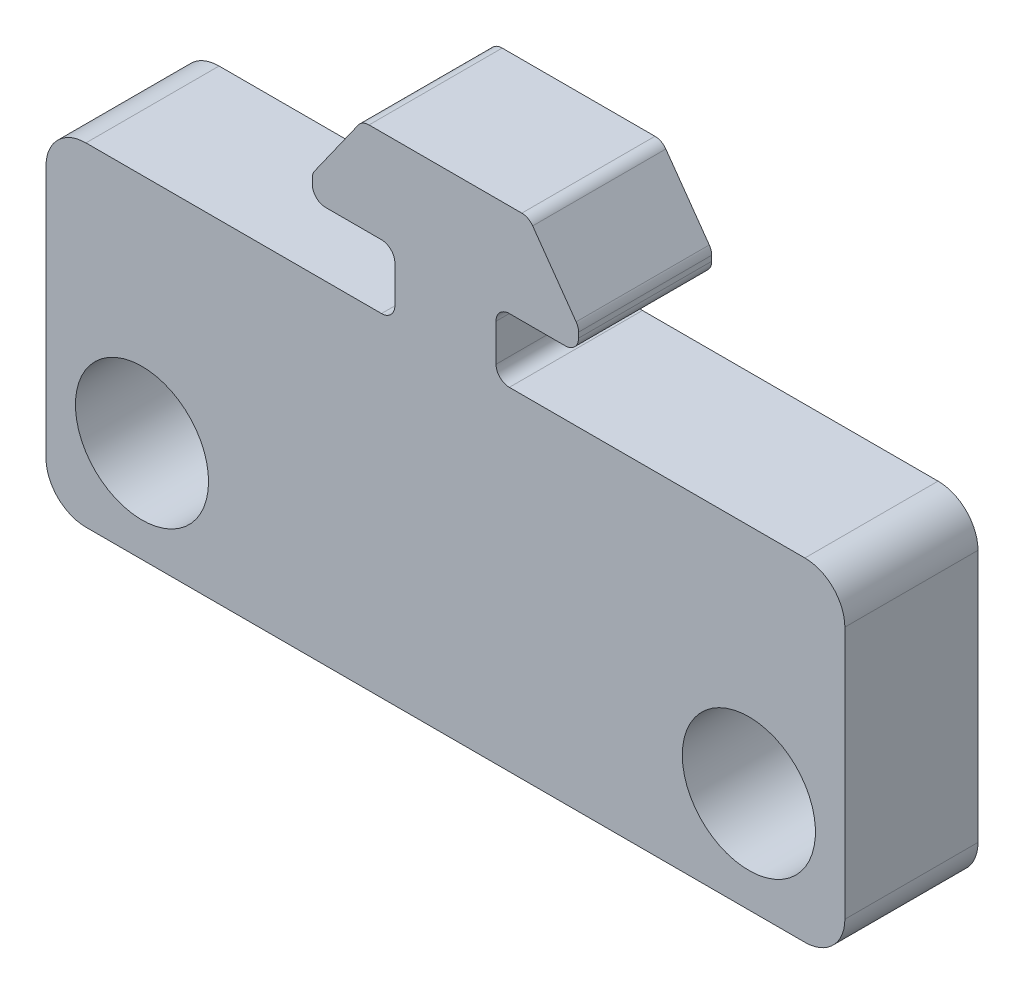
ISO-10303-21;
HEADER;
FILE_DESCRIPTION(('STEP AP214'),'2;1');
FILE_NAME('part.step','',(''),(''),'','','');
FILE_SCHEMA(('AUTOMOTIVE_DESIGN { 1 0 10303 214 1 1 1 1 }'));
ENDSEC;
DATA;
#1=APPLICATION_CONTEXT('core data for automotive mechanical design processes');
#2=APPLICATION_PROTOCOL_DEFINITION('international standard','automotive_design',2000,#1);
#3=PRODUCT_CONTEXT('',#1,'mechanical');
#4=PRODUCT('Part','Part','',(#3));
#5=PRODUCT_RELATED_PRODUCT_CATEGORY('part','',(#4));
#6=PRODUCT_DEFINITION_FORMATION('','',#4);
#7=PRODUCT_DEFINITION_CONTEXT('part definition',#1,'design');
#8=PRODUCT_DEFINITION('design','',#6,#7);
#9=PRODUCT_DEFINITION_SHAPE('','',#8);
#10=(LENGTH_UNIT() NAMED_UNIT(*) SI_UNIT(.MILLI.,.METRE.));
#11=(NAMED_UNIT(*) PLANE_ANGLE_UNIT() SI_UNIT($,.RADIAN.));
#12=(NAMED_UNIT(*) SI_UNIT($,.STERADIAN.) SOLID_ANGLE_UNIT());
#13=UNCERTAINTY_MEASURE_WITH_UNIT(LENGTH_MEASURE(1.E-05),#10,'distance_accuracy_value','');
#14=(GEOMETRIC_REPRESENTATION_CONTEXT(3) GLOBAL_UNCERTAINTY_ASSIGNED_CONTEXT((#13)) GLOBAL_UNIT_ASSIGNED_CONTEXT((#10,
#11,#12)) REPRESENTATION_CONTEXT('',''));
#15=CARTESIAN_POINT('',(0.,0.,0.));
#16=DIRECTION('',(0.,0.,1.));
#17=DIRECTION('',(1.,0.,0.));
#18=AXIS2_PLACEMENT_3D('',#15,#16,#17);
#19=CARTESIAN_POINT('',(0.,0.,10.));
#20=DIRECTION('',(0.,-1.,0.));
#21=DIRECTION('',(0.,0.,-1.));
#22=AXIS2_PLACEMENT_3D('',#19,#20,#21);
#23=PLANE('',#22);
#24=DIRECTION('',(-1.,0.,0.));
#25=VECTOR('',#24,1.);
#26=CARTESIAN_POINT('',(0.,0.,10.));
#27=LINE('',#26,#25);
#28=CARTESIAN_POINT('',(9.,0.,10.));
#29=VERTEX_POINT('',#28);
#30=CARTESIAN_POINT('',(4.8,0.,10.));
#31=VERTEX_POINT('',#30);
#32=EDGE_CURVE('E244',#29,#31,#27,.T.);
#33=ORIENTED_EDGE('',*,*,#32,.T.);
#34=DIRECTION('',(0.,0.,-1.));
#35=VECTOR('',#34,1.);
#36=CARTESIAN_POINT('',(4.8,0.,0.));
#37=LINE('',#36,#35);
#38=CARTESIAN_POINT('',(4.8,0.,0.));
#39=VERTEX_POINT('',#38);
#40=EDGE_CURVE('E349',#31,#39,#37,.T.);
#41=ORIENTED_EDGE('',*,*,#40,.T.);
#42=DIRECTION('',(-1.,0.,0.));
#43=VECTOR('',#42,1.);
#44=CARTESIAN_POINT('',(0.,0.,0.));
#45=LINE('',#44,#43);
#46=CARTESIAN_POINT('',(9.,0.,0.));
#47=VERTEX_POINT('',#46);
#48=EDGE_CURVE('E494',#47,#39,#45,.T.);
#49=ORIENTED_EDGE('',*,*,#48,.F.);
#50=DIRECTION('',(0.,0.,-1.));
#51=VECTOR('',#50,1.);
#52=CARTESIAN_POINT('',(9.,0.,10.));
#53=LINE('',#52,#51);
#54=EDGE_CURVE('E336',#47,#29,#53,.F.);
#55=ORIENTED_EDGE('',*,*,#54,.T.);
#56=EDGE_LOOP('',(#33,#41,#49,#55));
#57=FACE_BOUND('',#56,.T.);
#58=ADVANCED_FACE('F47',(#57),#23,.T.);
#59=CARTESIAN_POINT('',(-4.8,0.,0.));
#60=VERTEX_POINT('',#59);
#61=CARTESIAN_POINT('',(-9.,0.,0.));
#62=VERTEX_POINT('',#61);
#63=EDGE_CURVE('E499',#60,#62,#45,.T.);
#64=ORIENTED_EDGE('',*,*,#63,.F.);
#65=DIRECTION('',(0.,0.,-1.));
#66=VECTOR('',#65,1.);
#67=CARTESIAN_POINT('',(-4.8,0.,10.));
#68=LINE('',#67,#66);
#69=CARTESIAN_POINT('',(-4.8,0.,10.));
#70=VERTEX_POINT('',#69);
#71=EDGE_CURVE('E241',#60,#70,#68,.F.);
#72=ORIENTED_EDGE('',*,*,#71,.T.);
#73=CARTESIAN_POINT('',(-9.,0.,10.));
#74=VERTEX_POINT('',#73);
#75=EDGE_CURVE('E234',#70,#74,#27,.T.);
#76=ORIENTED_EDGE('',*,*,#75,.T.);
#77=DIRECTION('',(0.,0.,-1.));
#78=VECTOR('',#77,1.);
#79=CARTESIAN_POINT('',(-9.,0.,10.));
#80=LINE('',#79,#78);
#81=EDGE_CURVE('E239',#74,#62,#80,.T.);
#82=ORIENTED_EDGE('',*,*,#81,.T.);
#83=EDGE_LOOP('',(#64,#72,#76,#82));
#84=FACE_BOUND('',#83,.T.);
#85=ADVANCED_FACE('F237',(#84),#23,.T.);
#86=CARTESIAN_POINT('',(10.,0.,10.));
#87=DIRECTION('',(-1.,0.,0.));
#88=DIRECTION('',(0.,0.,1.));
#89=AXIS2_PLACEMENT_3D('',#86,#87,#88);
#90=PLANE('',#89);
#91=DIRECTION('',(0.,1.,0.));
#92=VECTOR('',#91,1.);
#93=CARTESIAN_POINT('',(10.,0.,10.));
#94=LINE('',#93,#92);
#95=CARTESIAN_POINT('',(10.,1.,10.));
#96=VERTEX_POINT('',#95);
#97=CARTESIAN_POINT('',(10.,1.39179018720823,10.));
#98=VERTEX_POINT('',#97);
#99=EDGE_CURVE('E479',#96,#98,#94,.T.);
#100=ORIENTED_EDGE('',*,*,#99,.F.);
#101=DIRECTION('',(0.,0.,-1.));
#102=VECTOR('',#101,1.);
#103=CARTESIAN_POINT('',(10.,1.,0.));
#104=LINE('',#103,#102);
#105=CARTESIAN_POINT('',(10.,1.,0.));
#106=VERTEX_POINT('',#105);
#107=EDGE_CURVE('E332',#96,#106,#104,.T.);
#108=ORIENTED_EDGE('',*,*,#107,.T.);
#109=DIRECTION('',(0.,1.,0.));
#110=VECTOR('',#109,1.);
#111=CARTESIAN_POINT('',(10.,0.,0.));
#112=LINE('',#111,#110);
#113=CARTESIAN_POINT('',(10.,1.39179018720823,0.));
#114=VERTEX_POINT('',#113);
#115=EDGE_CURVE('E498',#106,#114,#112,.T.);
#116=ORIENTED_EDGE('',*,*,#115,.T.);
#117=DIRECTION('',(0.,0.,-1.));
#118=VECTOR('',#117,1.);
#119=CARTESIAN_POINT('',(10.,1.39179018720823,10.));
#120=LINE('',#119,#118);
#121=EDGE_CURVE('E329',#114,#98,#120,.F.);
#122=ORIENTED_EDGE('',*,*,#121,.T.);
#123=EDGE_LOOP('',(#100,#108,#116,#122));
#124=FACE_BOUND('',#123,.T.);
#125=ADVANCED_FACE('F553',(#124),#90,.F.);
#126=CARTESIAN_POINT('',(7.46765073306512,5.28686501844186,10.));
#127=DIRECTION('',(-0.816164723344739,-0.57781930079187,0.));
#128=DIRECTION('',(0.57781930079187,-0.816164723344739,0.));
#129=AXIS2_PLACEMENT_3D('',#126,#127,#128);
#130=PLANE('',#129);
#131=DIRECTION('',(-0.57781930079187,0.816164723344739,0.));
#132=VECTOR('',#131,1.);
#133=CARTESIAN_POINT('',(7.46765073306512,5.28686501844186,0.));
#134=LINE('',#133,#132);
#135=CARTESIAN_POINT('',(9.81616472334474,1.9696094880001,0.));
#136=VERTEX_POINT('',#135);
#137=CARTESIAN_POINT('',(6.55369515590563,6.57781930079187,0.));
#138=VERTEX_POINT('',#137);
#139=EDGE_CURVE('E503',#136,#138,#134,.T.);
#140=ORIENTED_EDGE('',*,*,#139,.T.);
#141=DIRECTION('',(0.,0.,-1.));
#142=VECTOR('',#141,1.);
#143=CARTESIAN_POINT('',(6.55369515590563,6.57781930079187,10.));
#144=LINE('',#143,#142);
#145=CARTESIAN_POINT('',(6.55369515590563,6.57781930079187,10.));
#146=VERTEX_POINT('',#145);
#147=EDGE_CURVE('E326',#138,#146,#144,.F.);
#148=ORIENTED_EDGE('',*,*,#147,.T.);
#149=DIRECTION('',(-0.57781930079187,0.816164723344739,0.));
#150=VECTOR('',#149,1.);
#151=CARTESIAN_POINT('',(7.46765073306512,5.28686501844186,10.));
#152=LINE('',#151,#150);
#153=CARTESIAN_POINT('',(9.81616472334474,1.9696094880001,10.));
#154=VERTEX_POINT('',#153);
#155=EDGE_CURVE('E483',#154,#146,#152,.T.);
#156=ORIENTED_EDGE('',*,*,#155,.F.);
#157=DIRECTION('',(0.,0.,-1.));
#158=VECTOR('',#157,1.);
#159=CARTESIAN_POINT('',(9.81616472334474,1.9696094880001,10.));
#160=LINE('',#159,#158);
#161=EDGE_CURVE('E322',#154,#136,#160,.T.);
#162=ORIENTED_EDGE('',*,*,#161,.T.);
#163=EDGE_LOOP('',(#140,#148,#156,#162));
#164=FACE_BOUND('',#163,.T.);
#165=ADVANCED_FACE('F543',(#164),#130,.F.);
#166=CARTESIAN_POINT('',(0.,7.,10.));
#167=DIRECTION('',(0.,1.,0.));
#168=DIRECTION('',(0.,0.,1.));
#169=AXIS2_PLACEMENT_3D('',#166,#167,#168);
#170=PLANE('',#169);
#171=DIRECTION('',(1.,0.,0.));
#172=VECTOR('',#171,1.);
#173=CARTESIAN_POINT('',(0.,7.,0.));
#174=LINE('',#173,#172);
#175=CARTESIAN_POINT('',(-5.73753043256089,7.,0.));
#176=VERTEX_POINT('',#175);
#177=CARTESIAN_POINT('',(5.73753043256089,7.,0.));
#178=VERTEX_POINT('',#177);
#179=EDGE_CURVE('E507',#176,#178,#174,.T.);
#180=ORIENTED_EDGE('',*,*,#179,.F.);
#181=DIRECTION('',(0.,0.,-1.));
#182=VECTOR('',#181,1.);
#183=CARTESIAN_POINT('',(-5.73753043256089,7.,10.));
#184=LINE('',#183,#182);
#185=CARTESIAN_POINT('',(-5.73753043256089,7.,10.));
#186=VERTEX_POINT('',#185);
#187=EDGE_CURVE('E319',#176,#186,#184,.F.);
#188=ORIENTED_EDGE('',*,*,#187,.T.);
#189=DIRECTION('',(1.,0.,0.));
#190=VECTOR('',#189,1.);
#191=CARTESIAN_POINT('',(0.,7.,10.));
#192=LINE('',#191,#190);
#193=CARTESIAN_POINT('',(5.73753043256089,7.,10.));
#194=VERTEX_POINT('',#193);
#195=EDGE_CURVE('E487',#186,#194,#192,.T.);
#196=ORIENTED_EDGE('',*,*,#195,.T.);
#197=DIRECTION('',(0.,0.,-1.));
#198=VECTOR('',#197,1.);
#199=CARTESIAN_POINT('',(5.73753043256089,7.,0.));
#200=LINE('',#199,#198);
#201=EDGE_CURVE('E315',#194,#178,#200,.T.);
#202=ORIENTED_EDGE('',*,*,#201,.T.);
#203=EDGE_LOOP('',(#180,#188,#196,#202));
#204=FACE_BOUND('',#203,.T.);
#205=ADVANCED_FACE('F535',(#204),#170,.T.);
#206=CARTESIAN_POINT('',(-7.46765073306512,5.28686501844186,10.));
#207=DIRECTION('',(-0.816164723344739,0.57781930079187,0.));
#208=DIRECTION('',(-0.57781930079187,-0.816164723344739,0.));
#209=AXIS2_PLACEMENT_3D('',#206,#207,#208);
#210=PLANE('',#209);
#211=DIRECTION('',(0.57781930079187,0.816164723344739,0.));
#212=VECTOR('',#211,1.);
#213=CARTESIAN_POINT('',(-7.46765073306512,5.28686501844186,0.));
#214=LINE('',#213,#212);
#215=CARTESIAN_POINT('',(-9.81616472334474,1.9696094880001,0.));
#216=VERTEX_POINT('',#215);
#217=CARTESIAN_POINT('',(-6.55369515590563,6.57781930079187,0.));
#218=VERTEX_POINT('',#217);
#219=EDGE_CURVE('E510',#216,#218,#214,.T.);
#220=ORIENTED_EDGE('',*,*,#219,.F.);
#221=DIRECTION('',(0.,0.,-1.));
#222=VECTOR('',#221,1.);
#223=CARTESIAN_POINT('',(-9.81616472334474,1.9696094880001,10.));
#224=LINE('',#223,#222);
#225=CARTESIAN_POINT('',(-9.81616472334474,1.9696094880001,10.));
#226=VERTEX_POINT('',#225);
#227=EDGE_CURVE('E312',#216,#226,#224,.F.);
#228=ORIENTED_EDGE('',*,*,#227,.T.);
#229=DIRECTION('',(0.57781930079187,0.816164723344739,0.));
#230=VECTOR('',#229,1.);
#231=CARTESIAN_POINT('',(-7.46765073306512,5.28686501844186,10.));
#232=LINE('',#231,#230);
#233=CARTESIAN_POINT('',(-6.55369515590563,6.57781930079187,10.));
#234=VERTEX_POINT('',#233);
#235=EDGE_CURVE('E270',#226,#234,#232,.T.);
#236=ORIENTED_EDGE('',*,*,#235,.T.);
#237=DIRECTION('',(0.,0.,-1.));
#238=VECTOR('',#237,1.);
#239=CARTESIAN_POINT('',(-6.55369515590563,6.57781930079187,10.));
#240=LINE('',#239,#238);
#241=EDGE_CURVE('E257',#234,#218,#240,.T.);
#242=ORIENTED_EDGE('',*,*,#241,.T.);
#243=EDGE_LOOP('',(#220,#228,#236,#242));
#244=FACE_BOUND('',#243,.T.);
#245=ADVANCED_FACE('F526',(#244),#210,.T.);
#246=CARTESIAN_POINT('',(-10.,0.,10.));
#247=DIRECTION('',(-1.,0.,0.));
#248=DIRECTION('',(0.,0.,1.));
#249=AXIS2_PLACEMENT_3D('',#246,#247,#248);
#250=PLANE('',#249);
#251=DIRECTION('',(0.,1.,0.));
#252=VECTOR('',#251,1.);
#253=CARTESIAN_POINT('',(-10.,0.,0.));
#254=LINE('',#253,#252);
#255=CARTESIAN_POINT('',(-10.,1.,0.));
#256=VERTEX_POINT('',#255);
#257=CARTESIAN_POINT('',(-10.,1.39179018720823,0.));
#258=VERTEX_POINT('',#257);
#259=EDGE_CURVE('E245',#256,#258,#254,.T.);
#260=ORIENTED_EDGE('',*,*,#259,.F.);
#261=DIRECTION('',(0.,0.,-1.));
#262=VECTOR('',#261,1.);
#263=CARTESIAN_POINT('',(-10.,1.,10.));
#264=LINE('',#263,#262);
#265=CARTESIAN_POINT('',(-10.,1.,10.));
#266=VERTEX_POINT('',#265);
#267=EDGE_CURVE('E292',#256,#266,#264,.F.);
#268=ORIENTED_EDGE('',*,*,#267,.T.);
#269=DIRECTION('',(0.,1.,0.));
#270=VECTOR('',#269,1.);
#271=CARTESIAN_POINT('',(-10.,0.,10.));
#272=LINE('',#271,#270);
#273=CARTESIAN_POINT('',(-10.,1.39179018720823,10.));
#274=VERTEX_POINT('',#273);
#275=EDGE_CURVE('E253',#266,#274,#272,.T.);
#276=ORIENTED_EDGE('',*,*,#275,.T.);
#277=DIRECTION('',(0.,0.,-1.));
#278=VECTOR('',#277,1.);
#279=CARTESIAN_POINT('',(-10.,1.39179018720823,10.));
#280=LINE('',#279,#278);
#281=EDGE_CURVE('E288',#274,#258,#280,.T.);
#282=ORIENTED_EDGE('',*,*,#281,.T.);
#283=EDGE_LOOP('',(#260,#268,#276,#282));
#284=FACE_BOUND('',#283,.T.);
#285=ADVANCED_FACE('F518',(#284),#250,.T.);
#286=CARTESIAN_POINT('',(0.,0.,10.));
#287=DIRECTION('',(0.,0.,1.));
#288=DIRECTION('',(1.,0.,0.));
#289=AXIS2_PLACEMENT_3D('',#286,#287,#288);
#290=PLANE('',#289);
#291=CARTESIAN_POINT('',(-22.7909760636939,-22.227391231648,10.));
#292=DIRECTION('',(0.,0.,1.));
#293=DIRECTION('',(1.,0.,0.));
#294=AXIS2_PLACEMENT_3D('',#291,#292,#293);
#295=CIRCLE('',#294,5.);
#296=CARTESIAN_POINT('',(-17.7909760636939,-22.227391231648,10.));
#297=VERTEX_POINT('',#296);
#298=EDGE_CURVE('E457',#297,#297,#295,.T.);
#299=ORIENTED_EDGE('',*,*,#298,.F.);
#300=EDGE_LOOP('',(#299));
#301=FACE_BOUND('',#300,.T.);
#302=CARTESIAN_POINT('',(22.7909760636939,-22.227391231648,10.));
#303=DIRECTION('',(0.,0.,1.));
#304=DIRECTION('',(-1.,0.,0.));
#305=AXIS2_PLACEMENT_3D('',#302,#303,#304);
#306=CIRCLE('',#305,5.);
#307=CARTESIAN_POINT('',(17.7909760636939,-22.227391231648,10.));
#308=VERTEX_POINT('',#307);
#309=EDGE_CURVE('E926',#308,#308,#306,.T.);
#310=ORIENTED_EDGE('',*,*,#309,.F.);
#311=EDGE_LOOP('',(#310));
#312=FACE_BOUND('',#311,.T.);
#313=DIRECTION('',(-1.,0.,0.));
#314=VECTOR('',#313,1.);
#315=CARTESIAN_POINT('',(0.,-4.8,10.));
#316=LINE('',#315,#314);
#317=CARTESIAN_POINT('',(-4.8,-4.8,10.));
#318=VERTEX_POINT('',#317);
#319=CARTESIAN_POINT('',(-27.,-4.8,10.));
#320=VERTEX_POINT('',#319);
#321=EDGE_CURVE('E599',#318,#320,#316,.T.);
#322=ORIENTED_EDGE('',*,*,#321,.T.);
#323=CARTESIAN_POINT('',(-27.,-7.8,10.));
#324=DIRECTION('',(0.,0.,1.));
#325=DIRECTION('',(1.,0.,0.));
#326=AXIS2_PLACEMENT_3D('',#323,#324,#325);
#327=CIRCLE('',#326,3.);
#328=CARTESIAN_POINT('',(-30.,-7.8,10.));
#329=VERTEX_POINT('',#328);
#330=EDGE_CURVE('E419',#320,#329,#327,.T.);
#331=ORIENTED_EDGE('',*,*,#330,.T.);
#332=DIRECTION('',(0.,-1.,0.));
#333=VECTOR('',#332,1.);
#334=CARTESIAN_POINT('',(-30.,0.,10.));
#335=LINE('',#334,#333);
#336=CARTESIAN_POINT('',(-30.,-26.8,10.));
#337=VERTEX_POINT('',#336);
#338=EDGE_CURVE('E601',#329,#337,#335,.T.);
#339=ORIENTED_EDGE('',*,*,#338,.T.);
#340=CARTESIAN_POINT('',(-27.,-26.8,10.));
#341=DIRECTION('',(0.,0.,1.));
#342=DIRECTION('',(1.,0.,0.));
#343=AXIS2_PLACEMENT_3D('',#340,#341,#342);
#344=CIRCLE('',#343,3.);
#345=CARTESIAN_POINT('',(-27.,-29.8,10.));
#346=VERTEX_POINT('',#345);
#347=EDGE_CURVE('E416',#337,#346,#344,.T.);
#348=ORIENTED_EDGE('',*,*,#347,.T.);
#349=DIRECTION('',(1.,0.,0.));
#350=VECTOR('',#349,1.);
#351=CARTESIAN_POINT('',(0.,-29.8,10.));
#352=LINE('',#351,#350);
#353=CARTESIAN_POINT('',(27.,-29.8,10.));
#354=VERTEX_POINT('',#353);
#355=EDGE_CURVE('E475',#346,#354,#352,.T.);
#356=ORIENTED_EDGE('',*,*,#355,.T.);
#357=CARTESIAN_POINT('',(27.,-26.8,10.));
#358=DIRECTION('',(0.,0.,1.));
#359=DIRECTION('',(1.,0.,0.));
#360=AXIS2_PLACEMENT_3D('',#357,#358,#359);
#361=CIRCLE('',#360,3.);
#362=CARTESIAN_POINT('',(30.,-26.8,10.));
#363=VERTEX_POINT('',#362);
#364=EDGE_CURVE('E69',#354,#363,#361,.T.);
#365=ORIENTED_EDGE('',*,*,#364,.T.);
#366=DIRECTION('',(0.,-1.,0.));
#367=VECTOR('',#366,1.);
#368=CARTESIAN_POINT('',(30.,0.,10.));
#369=LINE('',#368,#367);
#370=CARTESIAN_POINT('',(30.,-7.8,10.));
#371=VERTEX_POINT('',#370);
#372=EDGE_CURVE('E441',#371,#363,#369,.T.);
#373=ORIENTED_EDGE('',*,*,#372,.F.);
#374=CARTESIAN_POINT('',(27.,-7.8,10.));
#375=DIRECTION('',(0.,0.,1.));
#376=DIRECTION('',(1.,0.,0.));
#377=AXIS2_PLACEMENT_3D('',#374,#375,#376);
#378=CIRCLE('',#377,3.);
#379=CARTESIAN_POINT('',(27.,-4.8,10.));
#380=VERTEX_POINT('',#379);
#381=EDGE_CURVE('E63',#371,#380,#378,.T.);
#382=ORIENTED_EDGE('',*,*,#381,.T.);
#383=DIRECTION('',(1.,0.,0.));
#384=VECTOR('',#383,1.);
#385=CARTESIAN_POINT('',(0.,-4.8,10.));
#386=LINE('',#385,#384);
#387=CARTESIAN_POINT('',(4.8,-4.8,10.));
#388=VERTEX_POINT('',#387);
#389=EDGE_CURVE('E582',#388,#380,#386,.T.);
#390=ORIENTED_EDGE('',*,*,#389,.F.);
#391=CARTESIAN_POINT('',(4.8,-3.8,10.));
#392=DIRECTION('',(0.,0.,1.));
#393=DIRECTION('',(1.,0.,0.));
#394=AXIS2_PLACEMENT_3D('',#391,#392,#393);
#395=CIRCLE('',#394,1.);
#396=CARTESIAN_POINT('',(3.8,-3.8,10.));
#397=VERTEX_POINT('',#396);
#398=EDGE_CURVE('E369',#388,#397,#395,.F.);
#399=ORIENTED_EDGE('',*,*,#398,.T.);
#400=DIRECTION('',(0.,-1.,0.));
#401=VECTOR('',#400,1.);
#402=CARTESIAN_POINT('',(3.8,0.,10.));
#403=LINE('',#402,#401);
#404=CARTESIAN_POINT('',(3.8,-1.,10.));
#405=VERTEX_POINT('',#404);
#406=EDGE_CURVE('E573',#405,#397,#403,.T.);
#407=ORIENTED_EDGE('',*,*,#406,.F.);
#408=CARTESIAN_POINT('',(4.8,-1.,10.));
#409=DIRECTION('',(0.,0.,1.));
#410=DIRECTION('',(1.,0.,0.));
#411=AXIS2_PLACEMENT_3D('',#408,#409,#410);
#412=CIRCLE('',#411,1.);
#413=EDGE_CURVE('E375',#405,#31,#412,.F.);
#414=ORIENTED_EDGE('',*,*,#413,.T.);
#415=ORIENTED_EDGE('',*,*,#32,.F.);
#416=CARTESIAN_POINT('',(9.,1.,10.));
#417=DIRECTION('',(0.,0.,1.));
#418=DIRECTION('',(1.,0.,0.));
#419=AXIS2_PLACEMENT_3D('',#416,#417,#418);
#420=CIRCLE('',#419,1.);
#421=EDGE_CURVE('E298',#29,#96,#420,.T.);
#422=ORIENTED_EDGE('',*,*,#421,.T.);
#423=ORIENTED_EDGE('',*,*,#99,.T.);
#424=CARTESIAN_POINT('',(9.,1.39179018720823,10.));
#425=DIRECTION('',(0.,0.,1.));
#426=DIRECTION('',(1.,0.,0.));
#427=AXIS2_PLACEMENT_3D('',#424,#425,#426);
#428=CIRCLE('',#427,1.);
#429=EDGE_CURVE('E295',#98,#154,#428,.T.);
#430=ORIENTED_EDGE('',*,*,#429,.T.);
#431=ORIENTED_EDGE('',*,*,#155,.T.);
#432=CARTESIAN_POINT('',(5.73753043256089,6.,10.));
#433=DIRECTION('',(0.,0.,1.));
#434=DIRECTION('',(1.,0.,0.));
#435=AXIS2_PLACEMENT_3D('',#432,#433,#434);
#436=CIRCLE('',#435,1.);
#437=EDGE_CURVE('E301',#146,#194,#436,.T.);
#438=ORIENTED_EDGE('',*,*,#437,.T.);
#439=ORIENTED_EDGE('',*,*,#195,.F.);
#440=CARTESIAN_POINT('',(-5.73753043256089,6.,10.));
#441=DIRECTION('',(0.,0.,1.));
#442=DIRECTION('',(1.,0.,0.));
#443=AXIS2_PLACEMENT_3D('',#440,#441,#442);
#444=CIRCLE('',#443,1.);
#445=EDGE_CURVE('E304',#186,#234,#444,.T.);
#446=ORIENTED_EDGE('',*,*,#445,.T.);
#447=ORIENTED_EDGE('',*,*,#235,.F.);
#448=CARTESIAN_POINT('',(-9.,1.39179018720823,10.));
#449=DIRECTION('',(0.,0.,1.));
#450=DIRECTION('',(1.,0.,0.));
#451=AXIS2_PLACEMENT_3D('',#448,#449,#450);
#452=CIRCLE('',#451,1.);
#453=EDGE_CURVE('E258',#226,#274,#452,.T.);
#454=ORIENTED_EDGE('',*,*,#453,.T.);
#455=ORIENTED_EDGE('',*,*,#275,.F.);
#456=CARTESIAN_POINT('',(-9.,1.,10.));
#457=DIRECTION('',(0.,0.,1.));
#458=DIRECTION('',(1.,0.,0.));
#459=AXIS2_PLACEMENT_3D('',#456,#457,#458);
#460=CIRCLE('',#459,1.);
#461=EDGE_CURVE('E249',#266,#74,#460,.T.);
#462=ORIENTED_EDGE('',*,*,#461,.T.);
#463=ORIENTED_EDGE('',*,*,#75,.F.);
#464=CARTESIAN_POINT('',(-4.8,-1.,10.));
#465=DIRECTION('',(0.,0.,1.));
#466=DIRECTION('',(1.,0.,0.));
#467=AXIS2_PLACEMENT_3D('',#464,#465,#466);
#468=CIRCLE('',#467,1.);
#469=CARTESIAN_POINT('',(-3.8,-1.,10.));
#470=VERTEX_POINT('',#469);
#471=EDGE_CURVE('E387',#70,#470,#468,.F.);
#472=ORIENTED_EDGE('',*,*,#471,.T.);
#473=DIRECTION('',(0.,-1.,0.));
#474=VECTOR('',#473,1.);
#475=CARTESIAN_POINT('',(-3.8,0.,10.));
#476=LINE('',#475,#474);
#477=CARTESIAN_POINT('',(-3.8,-3.8,10.));
#478=VERTEX_POINT('',#477);
#479=EDGE_CURVE('E595',#470,#478,#476,.T.);
#480=ORIENTED_EDGE('',*,*,#479,.T.);
#481=CARTESIAN_POINT('',(-4.8,-3.8,10.));
#482=DIRECTION('',(0.,0.,1.));
#483=DIRECTION('',(1.,0.,0.));
#484=AXIS2_PLACEMENT_3D('',#481,#482,#483);
#485=CIRCLE('',#484,1.);
#486=EDGE_CURVE('E381',#478,#318,#485,.F.);
#487=ORIENTED_EDGE('',*,*,#486,.T.);
#488=EDGE_LOOP('',(#322,#331,#339,#348,#356,#365,#373,#382,#390,#399,#407,#414,#415,#422,#423,
#430,#431,#438,#439,#446,#447,#454,#455,#462,#463,#472,#480,#487));
#489=FACE_BOUND('',#488,.T.);
#490=ADVANCED_FACE('F251',(#301,#312,#489),#290,.T.);
#491=CARTESIAN_POINT('',(0.,0.,0.));
#492=DIRECTION('',(0.,0.,1.));
#493=DIRECTION('',(1.,0.,0.));
#494=AXIS2_PLACEMENT_3D('',#491,#492,#493);
#495=PLANE('',#494);
#496=CARTESIAN_POINT('',(-22.7909760636939,-22.227391231648,0.));
#497=DIRECTION('',(0.,0.,1.));
#498=DIRECTION('',(1.,0.,0.));
#499=AXIS2_PLACEMENT_3D('',#496,#497,#498);
#500=CIRCLE('',#499,5.);
#501=CARTESIAN_POINT('',(-17.7909760636939,-22.227391231648,0.));
#502=VERTEX_POINT('',#501);
#503=EDGE_CURVE('E931',#502,#502,#500,.T.);
#504=ORIENTED_EDGE('',*,*,#503,.T.);
#505=EDGE_LOOP('',(#504));
#506=FACE_BOUND('',#505,.T.);
#507=CARTESIAN_POINT('',(22.7909760636939,-22.227391231648,0.));
#508=DIRECTION('',(0.,0.,1.));
#509=DIRECTION('',(-1.,0.,0.));
#510=AXIS2_PLACEMENT_3D('',#507,#508,#509);
#511=CIRCLE('',#510,5.);
#512=CARTESIAN_POINT('',(17.7909760636939,-22.227391231648,0.));
#513=VERTEX_POINT('',#512);
#514=EDGE_CURVE('E928',#513,#513,#511,.T.);
#515=ORIENTED_EDGE('',*,*,#514,.T.);
#516=EDGE_LOOP('',(#515));
#517=FACE_BOUND('',#516,.T.);
#518=DIRECTION('',(0.,-1.,0.));
#519=VECTOR('',#518,1.);
#520=CARTESIAN_POINT('',(-30.,0.,0.));
#521=LINE('',#520,#519);
#522=CARTESIAN_POINT('',(-30.,-7.8,0.));
#523=VERTEX_POINT('',#522);
#524=CARTESIAN_POINT('',(-30.,-26.8,0.));
#525=VERTEX_POINT('',#524);
#526=EDGE_CURVE('E472',#523,#525,#521,.T.);
#527=ORIENTED_EDGE('',*,*,#526,.F.);
#528=CARTESIAN_POINT('',(-27.,-7.8,0.));
#529=DIRECTION('',(0.,0.,1.));
#530=DIRECTION('',(1.,0.,0.));
#531=AXIS2_PLACEMENT_3D('',#528,#529,#530);
#532=CIRCLE('',#531,3.);
#533=CARTESIAN_POINT('',(-27.,-4.8,0.));
#534=VERTEX_POINT('',#533);
#535=EDGE_CURVE('E406',#523,#534,#532,.F.);
#536=ORIENTED_EDGE('',*,*,#535,.T.);
#537=DIRECTION('',(-1.,0.,0.));
#538=VECTOR('',#537,1.);
#539=CARTESIAN_POINT('',(0.,-4.8,0.));
#540=LINE('',#539,#538);
#541=CARTESIAN_POINT('',(-4.8,-4.8,0.));
#542=VERTEX_POINT('',#541);
#543=EDGE_CURVE('E468',#542,#534,#540,.T.);
#544=ORIENTED_EDGE('',*,*,#543,.F.);
#545=CARTESIAN_POINT('',(-4.8,-3.8,0.));
#546=DIRECTION('',(0.,0.,1.));
#547=DIRECTION('',(1.,0.,0.));
#548=AXIS2_PLACEMENT_3D('',#545,#546,#547);
#549=CIRCLE('',#548,1.);
#550=CARTESIAN_POINT('',(-3.8,-3.8,0.));
#551=VERTEX_POINT('',#550);
#552=EDGE_CURVE('E378',#542,#551,#549,.T.);
#553=ORIENTED_EDGE('',*,*,#552,.T.);
#554=DIRECTION('',(0.,-1.,0.));
#555=VECTOR('',#554,1.);
#556=CARTESIAN_POINT('',(-3.8,0.,0.));
#557=LINE('',#556,#555);
#558=CARTESIAN_POINT('',(-3.8,-1.,0.));
#559=VERTEX_POINT('',#558);
#560=EDGE_CURVE('E464',#559,#551,#557,.T.);
#561=ORIENTED_EDGE('',*,*,#560,.F.);
#562=CARTESIAN_POINT('',(-4.8,-1.,0.));
#563=DIRECTION('',(0.,0.,1.));
#564=DIRECTION('',(1.,0.,0.));
#565=AXIS2_PLACEMENT_3D('',#562,#563,#564);
#566=CIRCLE('',#565,1.);
#567=EDGE_CURVE('E384',#559,#60,#566,.T.);
#568=ORIENTED_EDGE('',*,*,#567,.T.);
#569=ORIENTED_EDGE('',*,*,#63,.T.);
#570=CARTESIAN_POINT('',(-9.,1.,0.));
#571=DIRECTION('',(0.,0.,1.));
#572=DIRECTION('',(1.,0.,0.));
#573=AXIS2_PLACEMENT_3D('',#570,#571,#572);
#574=CIRCLE('',#573,1.);
#575=EDGE_CURVE('E262',#62,#256,#574,.F.);
#576=ORIENTED_EDGE('',*,*,#575,.T.);
#577=ORIENTED_EDGE('',*,*,#259,.T.);
#578=CARTESIAN_POINT('',(-9.,1.39179018720823,0.));
#579=DIRECTION('',(0.,0.,1.));
#580=DIRECTION('',(1.,0.,0.));
#581=AXIS2_PLACEMENT_3D('',#578,#579,#580);
#582=CIRCLE('',#581,1.);
#583=EDGE_CURVE('E283',#258,#216,#582,.F.);
#584=ORIENTED_EDGE('',*,*,#583,.T.);
#585=ORIENTED_EDGE('',*,*,#219,.T.);
#586=CARTESIAN_POINT('',(-5.73753043256089,6.,0.));
#587=DIRECTION('',(0.,0.,1.));
#588=DIRECTION('',(1.,0.,0.));
#589=AXIS2_PLACEMENT_3D('',#586,#587,#588);
#590=CIRCLE('',#589,1.);
#591=EDGE_CURVE('E280',#218,#176,#590,.F.);
#592=ORIENTED_EDGE('',*,*,#591,.T.);
#593=ORIENTED_EDGE('',*,*,#179,.T.);
#594=CARTESIAN_POINT('',(5.73753043256089,6.,0.));
#595=DIRECTION('',(0.,0.,1.));
#596=DIRECTION('',(1.,0.,0.));
#597=AXIS2_PLACEMENT_3D('',#594,#595,#596);
#598=CIRCLE('',#597,1.);
#599=EDGE_CURVE('E277',#178,#138,#598,.F.);
#600=ORIENTED_EDGE('',*,*,#599,.T.);
#601=ORIENTED_EDGE('',*,*,#139,.F.);
#602=CARTESIAN_POINT('',(9.,1.39179018720823,0.));
#603=DIRECTION('',(0.,0.,1.));
#604=DIRECTION('',(1.,0.,0.));
#605=AXIS2_PLACEMENT_3D('',#602,#603,#604);
#606=CIRCLE('',#605,1.);
#607=EDGE_CURVE('E264',#136,#114,#606,.F.);
#608=ORIENTED_EDGE('',*,*,#607,.T.);
#609=ORIENTED_EDGE('',*,*,#115,.F.);
#610=CARTESIAN_POINT('',(9.,1.,0.));
#611=DIRECTION('',(0.,0.,1.));
#612=DIRECTION('',(1.,0.,0.));
#613=AXIS2_PLACEMENT_3D('',#610,#611,#612);
#614=CIRCLE('',#613,1.);
#615=EDGE_CURVE('E268',#106,#47,#614,.F.);
#616=ORIENTED_EDGE('',*,*,#615,.T.);
#617=ORIENTED_EDGE('',*,*,#48,.T.);
#618=CARTESIAN_POINT('',(4.8,-1.,0.));
#619=DIRECTION('',(0.,0.,1.));
#620=DIRECTION('',(1.,0.,0.));
#621=AXIS2_PLACEMENT_3D('',#618,#619,#620);
#622=CIRCLE('',#621,1.);
#623=CARTESIAN_POINT('',(3.8,-1.,0.));
#624=VERTEX_POINT('',#623);
#625=EDGE_CURVE('E372',#39,#624,#622,.T.);
#626=ORIENTED_EDGE('',*,*,#625,.T.);
#627=DIRECTION('',(0.,-1.,0.));
#628=VECTOR('',#627,1.);
#629=CARTESIAN_POINT('',(3.8,0.,0.));
#630=LINE('',#629,#628);
#631=CARTESIAN_POINT('',(3.8,-3.8,0.));
#632=VERTEX_POINT('',#631);
#633=EDGE_CURVE('E455',#624,#632,#630,.T.);
#634=ORIENTED_EDGE('',*,*,#633,.T.);
#635=CARTESIAN_POINT('',(4.8,-3.8,0.));
#636=DIRECTION('',(0.,0.,1.));
#637=DIRECTION('',(1.,0.,0.));
#638=AXIS2_PLACEMENT_3D('',#635,#636,#637);
#639=CIRCLE('',#638,1.);
#640=CARTESIAN_POINT('',(4.8,-4.8,0.));
#641=VERTEX_POINT('',#640);
#642=EDGE_CURVE('E366',#632,#641,#639,.T.);
#643=ORIENTED_EDGE('',*,*,#642,.T.);
#644=DIRECTION('',(1.,0.,0.));
#645=VECTOR('',#644,1.);
#646=CARTESIAN_POINT('',(0.,-4.8,0.));
#647=LINE('',#646,#645);
#648=CARTESIAN_POINT('',(27.,-4.8,0.));
#649=VERTEX_POINT('',#648);
#650=EDGE_CURVE('E450',#641,#649,#647,.T.);
#651=ORIENTED_EDGE('',*,*,#650,.T.);
#652=CARTESIAN_POINT('',(27.,-7.8,0.));
#653=DIRECTION('',(0.,0.,1.));
#654=DIRECTION('',(1.,0.,0.));
#655=AXIS2_PLACEMENT_3D('',#652,#653,#654);
#656=CIRCLE('',#655,3.);
#657=CARTESIAN_POINT('',(30.,-7.8,0.));
#658=VERTEX_POINT('',#657);
#659=EDGE_CURVE('E400',#649,#658,#656,.F.);
#660=ORIENTED_EDGE('',*,*,#659,.T.);
#661=DIRECTION('',(0.,-1.,0.));
#662=VECTOR('',#661,1.);
#663=CARTESIAN_POINT('',(30.,0.,0.));
#664=LINE('',#663,#662);
#665=CARTESIAN_POINT('',(30.,-26.8,0.));
#666=VERTEX_POINT('',#665);
#667=EDGE_CURVE('E439',#658,#666,#664,.T.);
#668=ORIENTED_EDGE('',*,*,#667,.T.);
#669=CARTESIAN_POINT('',(27.,-26.8,0.));
#670=DIRECTION('',(0.,0.,1.));
#671=DIRECTION('',(1.,0.,0.));
#672=AXIS2_PLACEMENT_3D('',#669,#670,#671);
#673=CIRCLE('',#672,3.);
#674=CARTESIAN_POINT('',(27.,-29.8,0.));
#675=VERTEX_POINT('',#674);
#676=EDGE_CURVE('E397',#666,#675,#673,.F.);
#677=ORIENTED_EDGE('',*,*,#676,.T.);
#678=DIRECTION('',(1.,0.,0.));
#679=VECTOR('',#678,1.);
#680=CARTESIAN_POINT('',(0.,-29.8,0.));
#681=LINE('',#680,#679);
#682=CARTESIAN_POINT('',(-27.,-29.8,0.));
#683=VERTEX_POINT('',#682);
#684=EDGE_CURVE('E451',#683,#675,#681,.T.);
#685=ORIENTED_EDGE('',*,*,#684,.F.);
#686=CARTESIAN_POINT('',(-27.,-26.8,0.));
#687=DIRECTION('',(0.,0.,1.));
#688=DIRECTION('',(1.,0.,0.));
#689=AXIS2_PLACEMENT_3D('',#686,#687,#688);
#690=CIRCLE('',#689,3.);
#691=EDGE_CURVE('E403',#683,#525,#690,.F.);
#692=ORIENTED_EDGE('',*,*,#691,.T.);
#693=EDGE_LOOP('',(#527,#536,#544,#553,#561,#568,#569,#576,#577,#584,#585,#592,#593,#600,#601,
#608,#609,#616,#617,#626,#634,#643,#651,#660,#668,#677,#685,#692));
#694=FACE_BOUND('',#693,.T.);
#695=ADVANCED_FACE('F445',(#506,#517,#694),#495,.F.);
#696=CARTESIAN_POINT('',(0.,-29.8,10.));
#697=DIRECTION('',(0.,1.,0.));
#698=DIRECTION('',(-1.,0.,0.));
#699=AXIS2_PLACEMENT_3D('',#696,#697,#698);
#700=PLANE('',#699);
#701=ORIENTED_EDGE('',*,*,#355,.F.);
#702=DIRECTION('',(0.,0.,-1.));
#703=VECTOR('',#702,1.);
#704=CARTESIAN_POINT('',(-27.,-29.8,10.));
#705=LINE('',#704,#703);
#706=EDGE_CURVE('E425',#346,#683,#705,.T.);
#707=ORIENTED_EDGE('',*,*,#706,.T.);
#708=ORIENTED_EDGE('',*,*,#684,.T.);
#709=DIRECTION('',(0.,0.,-1.));
#710=VECTOR('',#709,1.);
#711=CARTESIAN_POINT('',(27.,-29.8,10.));
#712=LINE('',#711,#710);
#713=EDGE_CURVE('E422',#675,#354,#712,.F.);
#714=ORIENTED_EDGE('',*,*,#713,.T.);
#715=EDGE_LOOP('',(#701,#707,#708,#714));
#716=FACE_BOUND('',#715,.T.);
#717=ADVANCED_FACE('F636',(#716),#700,.F.);
#718=CARTESIAN_POINT('',(30.,0.,10.));
#719=DIRECTION('',(1.,0.,0.));
#720=DIRECTION('',(0.,0.,-1.));
#721=AXIS2_PLACEMENT_3D('',#718,#719,#720);
#722=PLANE('',#721);
#723=ORIENTED_EDGE('',*,*,#667,.F.);
#724=DIRECTION('',(0.,0.,-1.));
#725=VECTOR('',#724,1.);
#726=CARTESIAN_POINT('',(30.,-7.8,10.));
#727=LINE('',#726,#725);
#728=EDGE_CURVE('E11',#658,#371,#727,.F.);
#729=ORIENTED_EDGE('',*,*,#728,.T.);
#730=ORIENTED_EDGE('',*,*,#372,.T.);
#731=DIRECTION('',(0.,0.,-1.));
#732=VECTOR('',#731,1.);
#733=CARTESIAN_POINT('',(30.,-26.8,0.));
#734=LINE('',#733,#732);
#735=EDGE_CURVE('E56',#363,#666,#734,.T.);
#736=ORIENTED_EDGE('',*,*,#735,.T.);
#737=EDGE_LOOP('',(#723,#729,#730,#736));
#738=FACE_BOUND('',#737,.T.);
#739=ADVANCED_FACE('F438',(#738),#722,.T.);
#740=CARTESIAN_POINT('',(0.,-4.8,10.));
#741=DIRECTION('',(0.,1.,0.));
#742=DIRECTION('',(-1.,0.,0.));
#743=AXIS2_PLACEMENT_3D('',#740,#741,#742);
#744=PLANE('',#743);
#745=ORIENTED_EDGE('',*,*,#389,.T.);
#746=DIRECTION('',(0.,0.,-1.));
#747=VECTOR('',#746,1.);
#748=CARTESIAN_POINT('',(27.,-4.8,10.));
#749=LINE('',#748,#747);
#750=EDGE_CURVE('E429',#380,#649,#749,.T.);
#751=ORIENTED_EDGE('',*,*,#750,.T.);
#752=ORIENTED_EDGE('',*,*,#650,.F.);
#753=DIRECTION('',(0.,0.,-1.));
#754=VECTOR('',#753,1.);
#755=CARTESIAN_POINT('',(4.8,-4.8,10.));
#756=LINE('',#755,#754);
#757=EDGE_CURVE('E346',#641,#388,#756,.F.);
#758=ORIENTED_EDGE('',*,*,#757,.T.);
#759=EDGE_LOOP('',(#745,#751,#752,#758));
#760=FACE_BOUND('',#759,.T.);
#761=ADVANCED_FACE('F580',(#760),#744,.T.);
#762=CARTESIAN_POINT('',(3.8,0.,10.));
#763=DIRECTION('',(1.,0.,0.));
#764=DIRECTION('',(0.,1.,0.));
#765=AXIS2_PLACEMENT_3D('',#762,#763,#764);
#766=PLANE('',#765);
#767=ORIENTED_EDGE('',*,*,#406,.T.);
#768=DIRECTION('',(0.,0.,-1.));
#769=VECTOR('',#768,1.);
#770=CARTESIAN_POINT('',(3.8,-3.8,0.));
#771=LINE('',#770,#769);
#772=EDGE_CURVE('E342',#397,#632,#771,.T.);
#773=ORIENTED_EDGE('',*,*,#772,.T.);
#774=ORIENTED_EDGE('',*,*,#633,.F.);
#775=DIRECTION('',(0.,0.,-1.));
#776=VECTOR('',#775,1.);
#777=CARTESIAN_POINT('',(3.8,-1.,10.));
#778=LINE('',#777,#776);
#779=EDGE_CURVE('E339',#624,#405,#778,.F.);
#780=ORIENTED_EDGE('',*,*,#779,.T.);
#781=EDGE_LOOP('',(#767,#773,#774,#780));
#782=FACE_BOUND('',#781,.T.);
#783=ADVANCED_FACE('F570',(#782),#766,.T.);
#784=CARTESIAN_POINT('',(-3.8,0.,10.));
#785=DIRECTION('',(1.,0.,0.));
#786=DIRECTION('',(0.,1.,0.));
#787=AXIS2_PLACEMENT_3D('',#784,#785,#786);
#788=PLANE('',#787);
#789=ORIENTED_EDGE('',*,*,#560,.T.);
#790=DIRECTION('',(0.,0.,-1.));
#791=VECTOR('',#790,1.);
#792=CARTESIAN_POINT('',(-3.8,-3.8,10.));
#793=LINE('',#792,#791);
#794=EDGE_CURVE('E361',#551,#478,#793,.F.);
#795=ORIENTED_EDGE('',*,*,#794,.T.);
#796=ORIENTED_EDGE('',*,*,#479,.F.);
#797=DIRECTION('',(0.,0.,-1.));
#798=VECTOR('',#797,1.);
#799=CARTESIAN_POINT('',(-3.8,-1.,10.));
#800=LINE('',#799,#798);
#801=EDGE_CURVE('E357',#470,#559,#800,.T.);
#802=ORIENTED_EDGE('',*,*,#801,.T.);
#803=EDGE_LOOP('',(#789,#795,#796,#802));
#804=FACE_BOUND('',#803,.T.);
#805=ADVANCED_FACE('F614',(#804),#788,.F.);
#806=CARTESIAN_POINT('',(0.,-4.8,10.));
#807=DIRECTION('',(0.,-1.,0.));
#808=DIRECTION('',(1.,0.,0.));
#809=AXIS2_PLACEMENT_3D('',#806,#807,#808);
#810=PLANE('',#809);
#811=ORIENTED_EDGE('',*,*,#543,.T.);
#812=DIRECTION('',(0.,0.,-1.));
#813=VECTOR('',#812,1.);
#814=CARTESIAN_POINT('',(-27.,-4.8,10.));
#815=LINE('',#814,#813);
#816=EDGE_CURVE('E409',#534,#320,#815,.F.);
#817=ORIENTED_EDGE('',*,*,#816,.T.);
#818=ORIENTED_EDGE('',*,*,#321,.F.);
#819=DIRECTION('',(0.,0.,-1.));
#820=VECTOR('',#819,1.);
#821=CARTESIAN_POINT('',(-4.8,-4.8,0.));
#822=LINE('',#821,#820);
#823=EDGE_CURVE('E353',#318,#542,#822,.T.);
#824=ORIENTED_EDGE('',*,*,#823,.T.);
#825=EDGE_LOOP('',(#811,#817,#818,#824));
#826=FACE_BOUND('',#825,.T.);
#827=ADVANCED_FACE('F622',(#826),#810,.F.);
#828=CARTESIAN_POINT('',(-30.,0.,10.));
#829=DIRECTION('',(1.,0.,0.));
#830=DIRECTION('',(0.,0.,-1.));
#831=AXIS2_PLACEMENT_3D('',#828,#829,#830);
#832=PLANE('',#831);
#833=ORIENTED_EDGE('',*,*,#338,.F.);
#834=DIRECTION('',(0.,0.,-1.));
#835=VECTOR('',#834,1.);
#836=CARTESIAN_POINT('',(-30.,-7.8,10.));
#837=LINE('',#836,#835);
#838=EDGE_CURVE('E393',#329,#523,#837,.T.);
#839=ORIENTED_EDGE('',*,*,#838,.T.);
#840=ORIENTED_EDGE('',*,*,#526,.T.);
#841=DIRECTION('',(0.,0.,-1.));
#842=VECTOR('',#841,1.);
#843=CARTESIAN_POINT('',(-30.,-26.8,10.));
#844=LINE('',#843,#842);
#845=EDGE_CURVE('E390',#525,#337,#844,.F.);
#846=ORIENTED_EDGE('',*,*,#845,.T.);
#847=EDGE_LOOP('',(#833,#839,#840,#846));
#848=FACE_BOUND('',#847,.T.);
#849=ADVANCED_FACE('F629',(#848),#832,.F.);
#850=CARTESIAN_POINT('',(22.7909760636939,-22.227391231648,10.));
#851=DIRECTION('',(0.,0.,-1.));
#852=DIRECTION('',(-1.,0.,0.));
#853=AXIS2_PLACEMENT_3D('',#850,#851,#852);
#854=CYLINDRICAL_SURFACE('',#853,5.);
#855=ORIENTED_EDGE('',*,*,#309,.T.);
#856=EDGE_LOOP('',(#855));
#857=FACE_BOUND('',#856,.T.);
#858=ORIENTED_EDGE('',*,*,#514,.F.);
#859=EDGE_LOOP('',(#858));
#860=FACE_BOUND('',#859,.T.);
#861=ADVANCED_FACE('F752',(#857,#860),#854,.F.);
#862=CARTESIAN_POINT('',(-22.7909760636939,-22.227391231648,10.));
#863=DIRECTION('',(0.,0.,-1.));
#864=DIRECTION('',(-1.,0.,0.));
#865=AXIS2_PLACEMENT_3D('',#862,#863,#864);
#866=CYLINDRICAL_SURFACE('',#865,5.);
#867=ORIENTED_EDGE('',*,*,#298,.T.);
#868=EDGE_LOOP('',(#867));
#869=FACE_BOUND('',#868,.T.);
#870=ORIENTED_EDGE('',*,*,#503,.F.);
#871=EDGE_LOOP('',(#870));
#872=FACE_BOUND('',#871,.T.);
#873=ADVANCED_FACE('F653',(#869,#872),#866,.F.);
#874=CARTESIAN_POINT('',(-9.,1.,10.));
#875=DIRECTION('',(0.,0.,-1.));
#876=DIRECTION('',(-1.,0.,0.));
#877=AXIS2_PLACEMENT_3D('',#874,#875,#876);
#878=CYLINDRICAL_SURFACE('',#877,1.);
#879=ORIENTED_EDGE('',*,*,#461,.F.);
#880=ORIENTED_EDGE('',*,*,#267,.F.);
#881=ORIENTED_EDGE('',*,*,#575,.F.);
#882=ORIENTED_EDGE('',*,*,#81,.F.);
#883=EDGE_LOOP('',(#879,#880,#881,#882));
#884=FACE_BOUND('',#883,.T.);
#885=ADVANCED_FACE('F261',(#884),#878,.T.);
#886=CARTESIAN_POINT('',(-9.,1.39179018720823,10.));
#887=DIRECTION('',(0.,0.,-1.));
#888=DIRECTION('',(-1.,0.,0.));
#889=AXIS2_PLACEMENT_3D('',#886,#887,#888);
#890=CYLINDRICAL_SURFACE('',#889,1.);
#891=ORIENTED_EDGE('',*,*,#453,.F.);
#892=ORIENTED_EDGE('',*,*,#227,.F.);
#893=ORIENTED_EDGE('',*,*,#583,.F.);
#894=ORIENTED_EDGE('',*,*,#281,.F.);
#895=EDGE_LOOP('',(#891,#892,#893,#894));
#896=FACE_BOUND('',#895,.T.);
#897=ADVANCED_FACE('F522',(#896),#890,.T.);
#898=CARTESIAN_POINT('',(-5.73753043256089,6.,10.));
#899=DIRECTION('',(0.,0.,-1.));
#900=DIRECTION('',(-1.,0.,0.));
#901=AXIS2_PLACEMENT_3D('',#898,#899,#900);
#902=CYLINDRICAL_SURFACE('',#901,1.);
#903=ORIENTED_EDGE('',*,*,#445,.F.);
#904=ORIENTED_EDGE('',*,*,#187,.F.);
#905=ORIENTED_EDGE('',*,*,#591,.F.);
#906=ORIENTED_EDGE('',*,*,#241,.F.);
#907=EDGE_LOOP('',(#903,#904,#905,#906));
#908=FACE_BOUND('',#907,.T.);
#909=ADVANCED_FACE('F532',(#908),#902,.T.);
#910=CARTESIAN_POINT('',(5.73753043256089,6.,10.));
#911=DIRECTION('',(0.,0.,1.));
#912=DIRECTION('',(1.,0.,0.));
#913=AXIS2_PLACEMENT_3D('',#910,#911,#912);
#914=CYLINDRICAL_SURFACE('',#913,1.);
#915=ORIENTED_EDGE('',*,*,#437,.F.);
#916=ORIENTED_EDGE('',*,*,#147,.F.);
#917=ORIENTED_EDGE('',*,*,#599,.F.);
#918=ORIENTED_EDGE('',*,*,#201,.F.);
#919=EDGE_LOOP('',(#915,#916,#917,#918));
#920=FACE_BOUND('',#919,.T.);
#921=ADVANCED_FACE('F539',(#920),#914,.T.);
#922=CARTESIAN_POINT('',(9.,1.,10.));
#923=DIRECTION('',(0.,0.,1.));
#924=DIRECTION('',(1.,0.,0.));
#925=AXIS2_PLACEMENT_3D('',#922,#923,#924);
#926=CYLINDRICAL_SURFACE('',#925,1.);
#927=ORIENTED_EDGE('',*,*,#421,.F.);
#928=ORIENTED_EDGE('',*,*,#54,.F.);
#929=ORIENTED_EDGE('',*,*,#615,.F.);
#930=ORIENTED_EDGE('',*,*,#107,.F.);
#931=EDGE_LOOP('',(#927,#928,#929,#930));
#932=FACE_BOUND('',#931,.T.);
#933=ADVANCED_FACE('F557',(#932),#926,.T.);
#934=CARTESIAN_POINT('',(9.,1.39179018720823,10.));
#935=DIRECTION('',(0.,0.,-1.));
#936=DIRECTION('',(-1.,0.,0.));
#937=AXIS2_PLACEMENT_3D('',#934,#935,#936);
#938=CYLINDRICAL_SURFACE('',#937,1.);
#939=ORIENTED_EDGE('',*,*,#429,.F.);
#940=ORIENTED_EDGE('',*,*,#121,.F.);
#941=ORIENTED_EDGE('',*,*,#607,.F.);
#942=ORIENTED_EDGE('',*,*,#161,.F.);
#943=EDGE_LOOP('',(#939,#940,#941,#942));
#944=FACE_BOUND('',#943,.T.);
#945=ADVANCED_FACE('F548',(#944),#938,.T.);
#946=CARTESIAN_POINT('',(4.8,-3.8,10.));
#947=DIRECTION('',(0.,0.,1.));
#948=DIRECTION('',(1.,0.,0.));
#949=AXIS2_PLACEMENT_3D('',#946,#947,#948);
#950=CYLINDRICAL_SURFACE('',#949,1.);
#951=ORIENTED_EDGE('',*,*,#398,.F.);
#952=ORIENTED_EDGE('',*,*,#757,.F.);
#953=ORIENTED_EDGE('',*,*,#642,.F.);
#954=ORIENTED_EDGE('',*,*,#772,.F.);
#955=EDGE_LOOP('',(#951,#952,#953,#954));
#956=FACE_BOUND('',#955,.T.);
#957=ADVANCED_FACE('F576',(#956),#950,.F.);
#958=CARTESIAN_POINT('',(4.8,-1.,10.));
#959=DIRECTION('',(0.,0.,1.));
#960=DIRECTION('',(1.,0.,0.));
#961=AXIS2_PLACEMENT_3D('',#958,#959,#960);
#962=CYLINDRICAL_SURFACE('',#961,1.);
#963=ORIENTED_EDGE('',*,*,#413,.F.);
#964=ORIENTED_EDGE('',*,*,#779,.F.);
#965=ORIENTED_EDGE('',*,*,#625,.F.);
#966=ORIENTED_EDGE('',*,*,#40,.F.);
#967=EDGE_LOOP('',(#963,#964,#965,#966));
#968=FACE_BOUND('',#967,.T.);
#969=ADVANCED_FACE('F565',(#968),#962,.F.);
#970=CARTESIAN_POINT('',(-4.8,-3.8,10.));
#971=DIRECTION('',(0.,0.,1.));
#972=DIRECTION('',(1.,0.,0.));
#973=AXIS2_PLACEMENT_3D('',#970,#971,#972);
#974=CYLINDRICAL_SURFACE('',#973,1.);
#975=ORIENTED_EDGE('',*,*,#486,.F.);
#976=ORIENTED_EDGE('',*,*,#794,.F.);
#977=ORIENTED_EDGE('',*,*,#552,.F.);
#978=ORIENTED_EDGE('',*,*,#823,.F.);
#979=EDGE_LOOP('',(#975,#976,#977,#978));
#980=FACE_BOUND('',#979,.T.);
#981=ADVANCED_FACE('F617',(#980),#974,.F.);
#982=CARTESIAN_POINT('',(-4.8,-1.,10.));
#983=DIRECTION('',(0.,0.,-1.));
#984=DIRECTION('',(-1.,0.,0.));
#985=AXIS2_PLACEMENT_3D('',#982,#983,#984);
#986=CYLINDRICAL_SURFACE('',#985,1.);
#987=ORIENTED_EDGE('',*,*,#471,.F.);
#988=ORIENTED_EDGE('',*,*,#71,.F.);
#989=ORIENTED_EDGE('',*,*,#567,.F.);
#990=ORIENTED_EDGE('',*,*,#801,.F.);
#991=EDGE_LOOP('',(#987,#988,#989,#990));
#992=FACE_BOUND('',#991,.T.);
#993=ADVANCED_FACE('F609',(#992),#986,.F.);
#994=CARTESIAN_POINT('',(-27.,-7.8,10.));
#995=DIRECTION('',(0.,0.,-1.));
#996=DIRECTION('',(-1.,0.,0.));
#997=AXIS2_PLACEMENT_3D('',#994,#995,#996);
#998=CYLINDRICAL_SURFACE('',#997,3.);
#999=ORIENTED_EDGE('',*,*,#330,.F.);
#1000=ORIENTED_EDGE('',*,*,#816,.F.);
#1001=ORIENTED_EDGE('',*,*,#535,.F.);
#1002=ORIENTED_EDGE('',*,*,#838,.F.);
#1003=EDGE_LOOP('',(#999,#1000,#1001,#1002));
#1004=FACE_BOUND('',#1003,.T.);
#1005=ADVANCED_FACE('F626',(#1004),#998,.T.);
#1006=CARTESIAN_POINT('',(-27.,-26.8,10.));
#1007=DIRECTION('',(0.,0.,-1.));
#1008=DIRECTION('',(-1.,0.,0.));
#1009=AXIS2_PLACEMENT_3D('',#1006,#1007,#1008);
#1010=CYLINDRICAL_SURFACE('',#1009,3.);
#1011=ORIENTED_EDGE('',*,*,#347,.F.);
#1012=ORIENTED_EDGE('',*,*,#845,.F.);
#1013=ORIENTED_EDGE('',*,*,#691,.F.);
#1014=ORIENTED_EDGE('',*,*,#706,.F.);
#1015=EDGE_LOOP('',(#1011,#1012,#1013,#1014));
#1016=FACE_BOUND('',#1015,.T.);
#1017=ADVANCED_FACE('F632',(#1016),#1010,.T.);
#1018=CARTESIAN_POINT('',(27.,-7.8,10.));
#1019=DIRECTION('',(0.,0.,-1.));
#1020=DIRECTION('',(-1.,0.,0.));
#1021=AXIS2_PLACEMENT_3D('',#1018,#1019,#1020);
#1022=CYLINDRICAL_SURFACE('',#1021,3.);
#1023=ORIENTED_EDGE('',*,*,#381,.F.);
#1024=ORIENTED_EDGE('',*,*,#728,.F.);
#1025=ORIENTED_EDGE('',*,*,#659,.F.);
#1026=ORIENTED_EDGE('',*,*,#750,.F.);
#1027=EDGE_LOOP('',(#1023,#1024,#1025,#1026));
#1028=FACE_BOUND('',#1027,.T.);
#1029=ADVANCED_FACE('F584',(#1028),#1022,.T.);
#1030=CARTESIAN_POINT('',(27.,-26.8,10.));
#1031=DIRECTION('',(0.,0.,1.));
#1032=DIRECTION('',(1.,0.,0.));
#1033=AXIS2_PLACEMENT_3D('',#1030,#1031,#1032);
#1034=CYLINDRICAL_SURFACE('',#1033,3.);
#1035=ORIENTED_EDGE('',*,*,#364,.F.);
#1036=ORIENTED_EDGE('',*,*,#713,.F.);
#1037=ORIENTED_EDGE('',*,*,#676,.F.);
#1038=ORIENTED_EDGE('',*,*,#735,.F.);
#1039=EDGE_LOOP('',(#1035,#1036,#1037,#1038));
#1040=FACE_BOUND('',#1039,.T.);
#1041=ADVANCED_FACE('F49',(#1040),#1034,.T.);
#1042=CLOSED_SHELL('',(#58,#85,#125,#165,#205,#245,#285,#490,#695,#717,#739,#761,#783,#805,#827,
#849,#861,#873,#885,#897,#909,#921,#933,#945,#957,#969,#981,#993,#1005,#1017,#1029,#1041));
#1043=MANIFOLD_SOLID_BREP('B2',#1042);
#1044=ADVANCED_BREP_SHAPE_REPRESENTATION('',(#18,#1043),#14);
#1045=SHAPE_DEFINITION_REPRESENTATION(#9,#1044);
ENDSEC;
END-ISO-10303-21;
